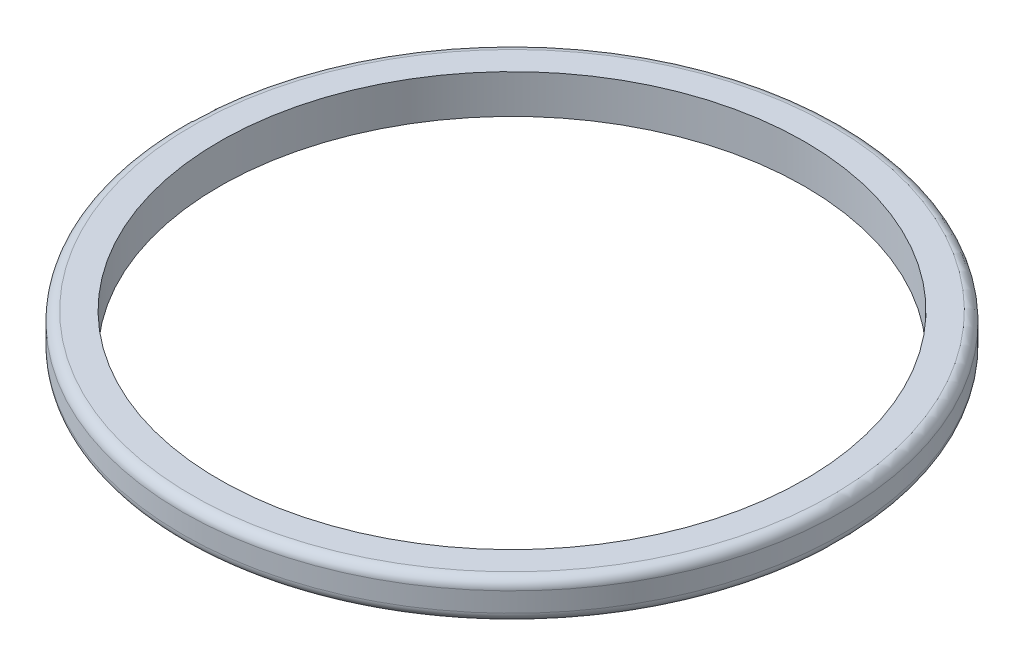
ISO-10303-21;
HEADER;
FILE_DESCRIPTION(('STEP AP214'),'2;1');
FILE_NAME('part.step','',(''),(''),'','','');
FILE_SCHEMA(('AUTOMOTIVE_DESIGN { 1 0 10303 214 1 1 1 1 }'));
ENDSEC;
DATA;
#1=APPLICATION_CONTEXT('core data for automotive mechanical design processes');
#2=APPLICATION_PROTOCOL_DEFINITION('international standard','automotive_design',2000,#1);
#3=PRODUCT_CONTEXT('',#1,'mechanical');
#4=PRODUCT('Part','Part','',(#3));
#5=PRODUCT_RELATED_PRODUCT_CATEGORY('part','',(#4));
#6=PRODUCT_DEFINITION_FORMATION('','',#4);
#7=PRODUCT_DEFINITION_CONTEXT('part definition',#1,'design');
#8=PRODUCT_DEFINITION('design','',#6,#7);
#9=PRODUCT_DEFINITION_SHAPE('','',#8);
#10=(LENGTH_UNIT() NAMED_UNIT(*) SI_UNIT(.MILLI.,.METRE.));
#11=(NAMED_UNIT(*) PLANE_ANGLE_UNIT() SI_UNIT($,.RADIAN.));
#12=(NAMED_UNIT(*) SI_UNIT($,.STERADIAN.) SOLID_ANGLE_UNIT());
#13=UNCERTAINTY_MEASURE_WITH_UNIT(LENGTH_MEASURE(1.E-05),#10,'distance_accuracy_value','');
#14=(GEOMETRIC_REPRESENTATION_CONTEXT(3) GLOBAL_UNCERTAINTY_ASSIGNED_CONTEXT((#13)) GLOBAL_UNIT_ASSIGNED_CONTEXT((#10,
#11,#12)) REPRESENTATION_CONTEXT('',''));
#15=CARTESIAN_POINT('',(0.,0.,0.));
#16=DIRECTION('',(0.,0.,1.));
#17=DIRECTION('',(1.,0.,0.));
#18=AXIS2_PLACEMENT_3D('',#15,#16,#17);
#19=CARTESIAN_POINT('',(0.,302.,0.));
#20=DIRECTION('',(0.,-1.,0.));
#21=DIRECTION('',(0.,0.,-1.));
#22=AXIS2_PLACEMENT_3D('',#19,#20,#21);
#23=PLANE('',#22);
#24=CARTESIAN_POINT('',(0.,302.,0.));
#25=DIRECTION('',(0.,-1.,0.));
#26=DIRECTION('',(0.,0.,-1.));
#27=AXIS2_PLACEMENT_3D('',#24,#25,#26);
#28=CIRCLE('',#27,16.5);
#29=CARTESIAN_POINT('',(0.,302.,-16.5));
#30=VERTEX_POINT('',#29);
#31=EDGE_CURVE('E10',#30,#30,#28,.T.);
#32=ORIENTED_EDGE('',*,*,#31,.T.);
#33=EDGE_LOOP('',(#32));
#34=FACE_BOUND('',#33,.T.);
#35=CARTESIAN_POINT('',(0.,302.,0.));
#36=DIRECTION('',(0.,-1.,0.));
#37=DIRECTION('',(0.,0.,-1.));
#38=AXIS2_PLACEMENT_3D('',#35,#36,#37);
#39=CIRCLE('',#38,15.1);
#40=CARTESIAN_POINT('',(0.,302.,-15.1));
#41=VERTEX_POINT('',#40);
#42=EDGE_CURVE('E50',#41,#41,#39,.T.);
#43=ORIENTED_EDGE('',*,*,#42,.F.);
#44=EDGE_LOOP('',(#43));
#45=FACE_BOUND('',#44,.T.);
#46=ADVANCED_FACE('F30',(#34,#45),#23,.T.);
#47=CARTESIAN_POINT('',(0.,304.,0.));
#48=DIRECTION('',(0.,-1.,0.));
#49=DIRECTION('',(0.,0.,-1.));
#50=AXIS2_PLACEMENT_3D('',#47,#48,#49);
#51=PLANE('',#50);
#52=CARTESIAN_POINT('',(0.,304.,0.));
#53=DIRECTION('',(0.,-1.,0.));
#54=DIRECTION('',(0.,0.,-1.));
#55=AXIS2_PLACEMENT_3D('',#52,#53,#54);
#56=CIRCLE('',#55,16.5);
#57=CARTESIAN_POINT('',(0.,304.,-16.5));
#58=VERTEX_POINT('',#57);
#59=EDGE_CURVE('E37',#58,#58,#56,.F.);
#60=ORIENTED_EDGE('',*,*,#59,.T.);
#61=EDGE_LOOP('',(#60));
#62=FACE_BOUND('',#61,.T.);
#63=CARTESIAN_POINT('',(0.,304.,0.));
#64=DIRECTION('',(0.,-1.,0.));
#65=DIRECTION('',(0.,0.,-1.));
#66=AXIS2_PLACEMENT_3D('',#63,#64,#65);
#67=CIRCLE('',#66,15.1);
#68=CARTESIAN_POINT('',(0.,304.,-15.1));
#69=VERTEX_POINT('',#68);
#70=EDGE_CURVE('E51',#69,#69,#67,.T.);
#71=ORIENTED_EDGE('',*,*,#70,.T.);
#72=EDGE_LOOP('',(#71));
#73=FACE_BOUND('',#72,.T.);
#74=ADVANCED_FACE('F61',(#62,#73),#51,.F.);
#75=CARTESIAN_POINT('',(0.,302.,0.));
#76=DIRECTION('',(0.,1.,0.));
#77=DIRECTION('',(0.,0.,1.));
#78=AXIS2_PLACEMENT_3D('',#75,#76,#77);
#79=CYLINDRICAL_SURFACE('',#78,17.);
#80=CARTESIAN_POINT('',(0.,303.5,0.));
#81=DIRECTION('',(0.,-1.,0.));
#82=DIRECTION('',(0.,0.,-1.));
#83=AXIS2_PLACEMENT_3D('',#80,#81,#82);
#84=CIRCLE('',#83,17.);
#85=CARTESIAN_POINT('',(0.,303.5,-17.));
#86=VERTEX_POINT('',#85);
#87=EDGE_CURVE('E41',#86,#86,#84,.T.);
#88=ORIENTED_EDGE('',*,*,#87,.T.);
#89=EDGE_LOOP('',(#88));
#90=FACE_BOUND('',#89,.T.);
#91=CARTESIAN_POINT('',(0.,302.5,0.));
#92=DIRECTION('',(0.,-1.,0.));
#93=DIRECTION('',(0.,0.,-1.));
#94=AXIS2_PLACEMENT_3D('',#91,#92,#93);
#95=CIRCLE('',#94,17.);
#96=CARTESIAN_POINT('',(0.,302.5,-17.));
#97=VERTEX_POINT('',#96);
#98=EDGE_CURVE('E45',#97,#97,#95,.F.);
#99=ORIENTED_EDGE('',*,*,#98,.T.);
#100=EDGE_LOOP('',(#99));
#101=FACE_BOUND('',#100,.T.);
#102=ADVANCED_FACE('F66',(#90,#101),#79,.T.);
#103=CARTESIAN_POINT('',(0.,302.,0.));
#104=DIRECTION('',(0.,1.,0.));
#105=DIRECTION('',(0.,0.,1.));
#106=AXIS2_PLACEMENT_3D('',#103,#104,#105);
#107=CYLINDRICAL_SURFACE('',#106,15.1);
#108=ORIENTED_EDGE('',*,*,#42,.T.);
#109=EDGE_LOOP('',(#108));
#110=FACE_BOUND('',#109,.T.);
#111=ORIENTED_EDGE('',*,*,#70,.F.);
#112=EDGE_LOOP('',(#111));
#113=FACE_BOUND('',#112,.T.);
#114=ADVANCED_FACE('F57',(#110,#113),#107,.F.);
#115=CARTESIAN_POINT('',(0.,303.5,0.));
#116=DIRECTION('',(0.,-1.,0.));
#117=DIRECTION('',(0.,0.,-1.));
#118=AXIS2_PLACEMENT_3D('',#115,#116,#117);
#119=TOROIDAL_SURFACE('',#118,16.5,0.5);
#120=ORIENTED_EDGE('',*,*,#59,.F.);
#121=EDGE_LOOP('',(#120));
#122=FACE_BOUND('',#121,.T.);
#123=ORIENTED_EDGE('',*,*,#87,.F.);
#124=EDGE_LOOP('',(#123));
#125=FACE_BOUND('',#124,.T.);
#126=ADVANCED_FACE('F72',(#122,#125),#119,.T.);
#127=CARTESIAN_POINT('',(0.,302.5,0.));
#128=DIRECTION('',(0.,-1.,0.));
#129=DIRECTION('',(0.,0.,-1.));
#130=AXIS2_PLACEMENT_3D('',#127,#128,#129);
#131=TOROIDAL_SURFACE('',#130,16.5,0.5);
#132=ORIENTED_EDGE('',*,*,#98,.F.);
#133=EDGE_LOOP('',(#132));
#134=FACE_BOUND('',#133,.T.);
#135=ORIENTED_EDGE('',*,*,#31,.F.);
#136=EDGE_LOOP('',(#135));
#137=FACE_BOUND('',#136,.T.);
#138=ADVANCED_FACE('F32',(#134,#137),#131,.T.);
#139=CLOSED_SHELL('',(#46,#74,#102,#114,#126,#138));
#140=MANIFOLD_SOLID_BREP('B2',#139);
#141=ADVANCED_BREP_SHAPE_REPRESENTATION('',(#18,#140),#14);
#142=SHAPE_DEFINITION_REPRESENTATION(#9,#141);
ENDSEC;
END-ISO-10303-21;
